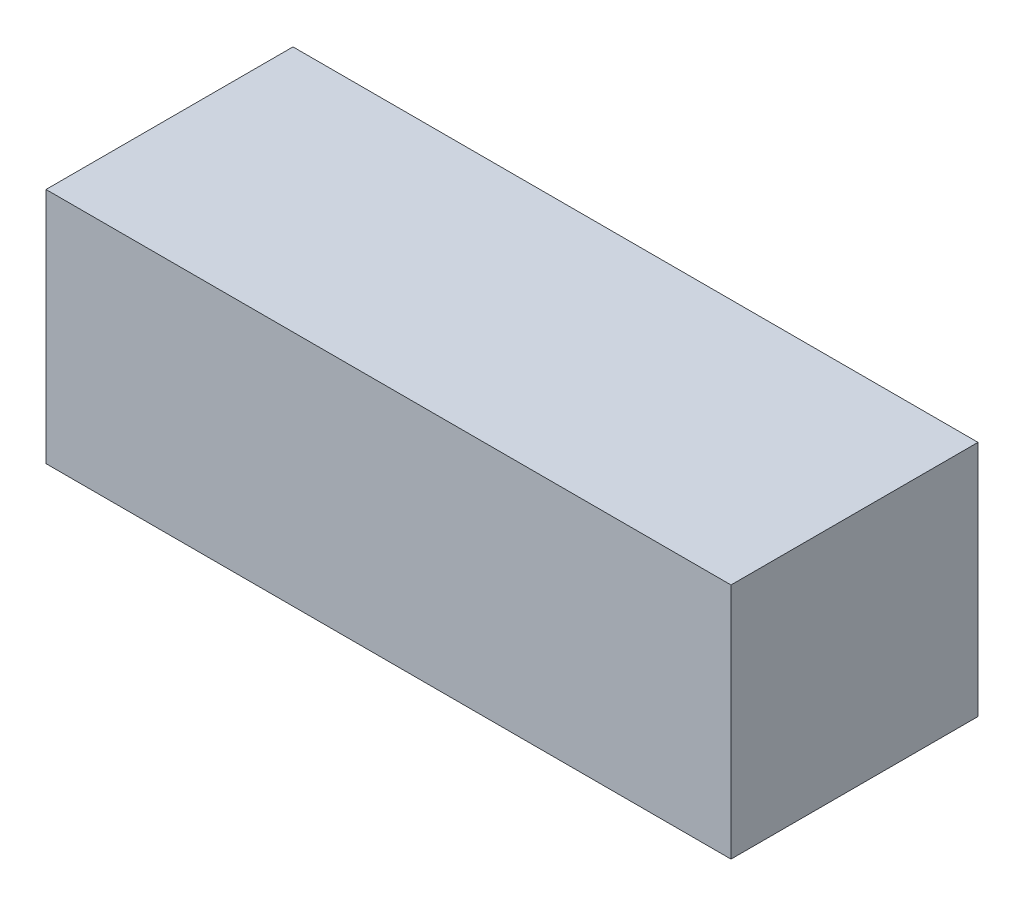
ISO-10303-21;
HEADER;
FILE_DESCRIPTION(('STEP AP214'),'2;1');
FILE_NAME('part.step','',(''),(''),'','','');
FILE_SCHEMA(('AUTOMOTIVE_DESIGN { 1 0 10303 214 1 1 1 1 }'));
ENDSEC;
DATA;
#1=APPLICATION_CONTEXT('core data for automotive mechanical design processes');
#2=APPLICATION_PROTOCOL_DEFINITION('international standard','automotive_design',2000,#1);
#3=PRODUCT_CONTEXT('',#1,'mechanical');
#4=PRODUCT('Part','Part','',(#3));
#5=PRODUCT_RELATED_PRODUCT_CATEGORY('part','',(#4));
#6=PRODUCT_DEFINITION_FORMATION('','',#4);
#7=PRODUCT_DEFINITION_CONTEXT('part definition',#1,'design');
#8=PRODUCT_DEFINITION('design','',#6,#7);
#9=PRODUCT_DEFINITION_SHAPE('','',#8);
#10=(LENGTH_UNIT() NAMED_UNIT(*) SI_UNIT(.MILLI.,.METRE.));
#11=(NAMED_UNIT(*) PLANE_ANGLE_UNIT() SI_UNIT($,.RADIAN.));
#12=(NAMED_UNIT(*) SI_UNIT($,.STERADIAN.) SOLID_ANGLE_UNIT());
#13=UNCERTAINTY_MEASURE_WITH_UNIT(LENGTH_MEASURE(1.E-05),#10,'distance_accuracy_value','');
#14=(GEOMETRIC_REPRESENTATION_CONTEXT(3) GLOBAL_UNCERTAINTY_ASSIGNED_CONTEXT((#13)) GLOBAL_UNIT_ASSIGNED_CONTEXT((#10,
#11,#12)) REPRESENTATION_CONTEXT('',''));
#15=CARTESIAN_POINT('',(0.,0.,0.));
#16=DIRECTION('',(0.,0.,1.));
#17=DIRECTION('',(1.,0.,0.));
#18=AXIS2_PLACEMENT_3D('',#15,#16,#17);
#19=CARTESIAN_POINT('',(47.5974896137187,33.,17.1625563511005));
#20=DIRECTION('',(-1.,0.,0.));
#21=DIRECTION('',(0.,0.,1.));
#22=AXIS2_PLACEMENT_3D('',#19,#20,#21);
#23=PLANE('',#22);
#24=DIRECTION('',(0.,0.,-1.));
#25=VECTOR('',#24,1.);
#26=CARTESIAN_POINT('',(47.5974896137187,0.,17.1625563511005));
#27=LINE('',#26,#25);
#28=CARTESIAN_POINT('',(47.5974896137187,0.,17.1625563511005));
#29=VERTEX_POINT('',#28);
#30=CARTESIAN_POINT('',(47.5974896137187,0.,-17.1625563511005));
#31=VERTEX_POINT('',#30);
#32=EDGE_CURVE('E96',#29,#31,#27,.T.);
#33=ORIENTED_EDGE('',*,*,#32,.T.);
#34=DIRECTION('',(0.,-1.,0.));
#35=VECTOR('',#34,1.);
#36=CARTESIAN_POINT('',(47.5974896137187,33.,-17.1625563511005));
#37=LINE('',#36,#35);
#38=CARTESIAN_POINT('',(47.5974896137187,33.,-17.1625563511005));
#39=VERTEX_POINT('',#38);
#40=EDGE_CURVE('E11',#39,#31,#37,.T.);
#41=ORIENTED_EDGE('',*,*,#40,.F.);
#42=DIRECTION('',(0.,0.,-1.));
#43=VECTOR('',#42,1.);
#44=CARTESIAN_POINT('',(47.5974896137187,33.,17.1625563511005));
#45=LINE('',#44,#43);
#46=CARTESIAN_POINT('',(47.5974896137187,33.,17.1625563511005));
#47=VERTEX_POINT('',#46);
#48=EDGE_CURVE('E84',#47,#39,#45,.T.);
#49=ORIENTED_EDGE('',*,*,#48,.F.);
#50=DIRECTION('',(0.,-1.,0.));
#51=VECTOR('',#50,1.);
#52=CARTESIAN_POINT('',(47.5974896137187,33.,17.1625563511005));
#53=LINE('',#52,#51);
#54=EDGE_CURVE('E92',#47,#29,#53,.T.);
#55=ORIENTED_EDGE('',*,*,#54,.T.);
#56=EDGE_LOOP('',(#33,#41,#49,#55));
#57=FACE_BOUND('',#56,.T.);
#58=ADVANCED_FACE('F33',(#57),#23,.F.);
#59=CARTESIAN_POINT('',(-47.5974896137187,33.,-17.1625563511005));
#60=DIRECTION('',(0.,0.,1.));
#61=DIRECTION('',(1.,0.,0.));
#62=AXIS2_PLACEMENT_3D('',#59,#60,#61);
#63=PLANE('',#62);
#64=DIRECTION('',(-1.,0.,0.));
#65=VECTOR('',#64,1.);
#66=CARTESIAN_POINT('',(-47.5974896137187,0.,-17.1625563511005));
#67=LINE('',#66,#65);
#68=CARTESIAN_POINT('',(-47.5974896137187,0.,-17.1625563511005));
#69=VERTEX_POINT('',#68);
#70=EDGE_CURVE('E88',#31,#69,#67,.T.);
#71=ORIENTED_EDGE('',*,*,#70,.T.);
#72=DIRECTION('',(0.,-1.,0.));
#73=VECTOR('',#72,1.);
#74=CARTESIAN_POINT('',(-47.5974896137187,33.,-17.1625563511005));
#75=LINE('',#74,#73);
#76=CARTESIAN_POINT('',(-47.5974896137187,33.,-17.1625563511005));
#77=VERTEX_POINT('',#76);
#78=EDGE_CURVE('E41',#77,#69,#75,.T.);
#79=ORIENTED_EDGE('',*,*,#78,.F.);
#80=DIRECTION('',(-1.,0.,0.));
#81=VECTOR('',#80,1.);
#82=CARTESIAN_POINT('',(-47.5974896137187,33.,-17.1625563511005));
#83=LINE('',#82,#81);
#84=EDGE_CURVE('E79',#39,#77,#83,.T.);
#85=ORIENTED_EDGE('',*,*,#84,.F.);
#86=ORIENTED_EDGE('',*,*,#40,.T.);
#87=EDGE_LOOP('',(#71,#79,#85,#86));
#88=FACE_BOUND('',#87,.T.);
#89=ADVANCED_FACE('F87',(#88),#63,.F.);
#90=CARTESIAN_POINT('',(-47.5974896137187,33.,17.1625563511005));
#91=DIRECTION('',(1.,0.,0.));
#92=DIRECTION('',(0.,0.,-1.));
#93=AXIS2_PLACEMENT_3D('',#90,#91,#92);
#94=PLANE('',#93);
#95=DIRECTION('',(0.,0.,1.));
#96=VECTOR('',#95,1.);
#97=CARTESIAN_POINT('',(-47.5974896137187,0.,17.1625563511005));
#98=LINE('',#97,#96);
#99=CARTESIAN_POINT('',(-47.5974896137187,0.,17.1625563511005));
#100=VERTEX_POINT('',#99);
#101=EDGE_CURVE('E66',#69,#100,#98,.T.);
#102=ORIENTED_EDGE('',*,*,#101,.T.);
#103=DIRECTION('',(0.,-1.,0.));
#104=VECTOR('',#103,1.);
#105=CARTESIAN_POINT('',(-47.5974896137187,33.,17.1625563511005));
#106=LINE('',#105,#104);
#107=CARTESIAN_POINT('',(-47.5974896137187,33.,17.1625563511005));
#108=VERTEX_POINT('',#107);
#109=EDGE_CURVE('E89',#108,#100,#106,.T.);
#110=ORIENTED_EDGE('',*,*,#109,.F.);
#111=DIRECTION('',(0.,0.,1.));
#112=VECTOR('',#111,1.);
#113=CARTESIAN_POINT('',(-47.5974896137187,33.,17.1625563511005));
#114=LINE('',#113,#112);
#115=EDGE_CURVE('E82',#77,#108,#114,.T.);
#116=ORIENTED_EDGE('',*,*,#115,.F.);
#117=ORIENTED_EDGE('',*,*,#78,.T.);
#118=EDGE_LOOP('',(#102,#110,#116,#117));
#119=FACE_BOUND('',#118,.T.);
#120=ADVANCED_FACE('F90',(#119),#94,.F.);
#121=CARTESIAN_POINT('',(-47.5974896137187,33.,17.1625563511005));
#122=DIRECTION('',(0.,0.,-1.));
#123=DIRECTION('',(-1.,0.,0.));
#124=AXIS2_PLACEMENT_3D('',#121,#122,#123);
#125=PLANE('',#124);
#126=DIRECTION('',(1.,0.,0.));
#127=VECTOR('',#126,1.);
#128=CARTESIAN_POINT('',(-47.5974896137187,0.,17.1625563511005));
#129=LINE('',#128,#127);
#130=EDGE_CURVE('E72',#100,#29,#129,.T.);
#131=ORIENTED_EDGE('',*,*,#130,.T.);
#132=ORIENTED_EDGE('',*,*,#54,.F.);
#133=DIRECTION('',(1.,0.,0.));
#134=VECTOR('',#133,1.);
#135=CARTESIAN_POINT('',(-47.5974896137187,33.,17.1625563511005));
#136=LINE('',#135,#134);
#137=EDGE_CURVE('E49',#108,#47,#136,.T.);
#138=ORIENTED_EDGE('',*,*,#137,.F.);
#139=ORIENTED_EDGE('',*,*,#109,.T.);
#140=EDGE_LOOP('',(#131,#132,#138,#139));
#141=FACE_BOUND('',#140,.T.);
#142=ADVANCED_FACE('F103',(#141),#125,.F.);
#143=CARTESIAN_POINT('',(0.,33.,0.));
#144=DIRECTION('',(0.,-1.,0.));
#145=DIRECTION('',(0.,0.,-1.));
#146=AXIS2_PLACEMENT_3D('',#143,#144,#145);
#147=PLANE('',#146);
#148=ORIENTED_EDGE('',*,*,#48,.T.);
#149=ORIENTED_EDGE('',*,*,#84,.T.);
#150=ORIENTED_EDGE('',*,*,#115,.T.);
#151=ORIENTED_EDGE('',*,*,#137,.T.);
#152=EDGE_LOOP('',(#148,#149,#150,#151));
#153=FACE_BOUND('',#152,.T.);
#154=ADVANCED_FACE('F80',(#153),#147,.F.);
#155=CARTESIAN_POINT('',(0.,0.,0.));
#156=DIRECTION('',(0.,-1.,0.));
#157=DIRECTION('',(0.,0.,-1.));
#158=AXIS2_PLACEMENT_3D('',#155,#156,#157);
#159=PLANE('',#158);
#160=ORIENTED_EDGE('',*,*,#32,.F.);
#161=ORIENTED_EDGE('',*,*,#130,.F.);
#162=ORIENTED_EDGE('',*,*,#101,.F.);
#163=ORIENTED_EDGE('',*,*,#70,.F.);
#164=EDGE_LOOP('',(#160,#161,#162,#163));
#165=FACE_BOUND('',#164,.T.);
#166=ADVANCED_FACE('F106',(#165),#159,.T.);
#167=CLOSED_SHELL('',(#58,#89,#120,#142,#154,#166));
#168=MANIFOLD_SOLID_BREP('B2',#167);
#169=ADVANCED_BREP_SHAPE_REPRESENTATION('',(#18,#168),#14);
#170=SHAPE_DEFINITION_REPRESENTATION(#9,#169);
ENDSEC;
END-ISO-10303-21;
